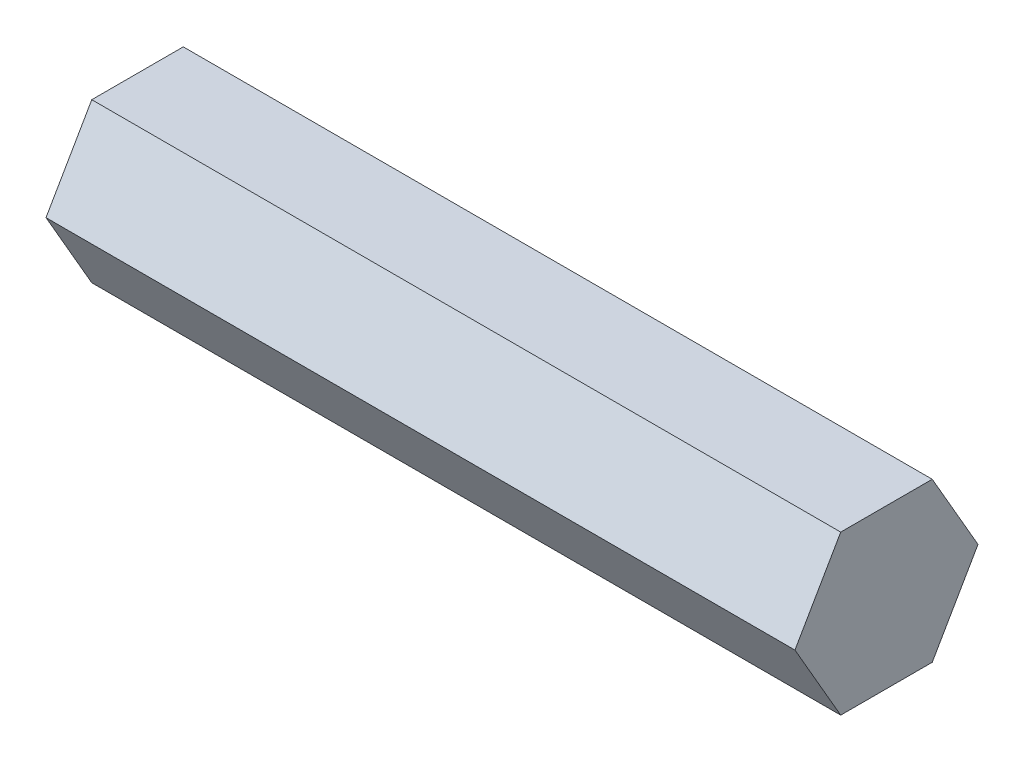
ISO-10303-21;
HEADER;
FILE_DESCRIPTION(('STEP AP214'),'2;1');
FILE_NAME('part.step','',(''),(''),'','','');
FILE_SCHEMA(('AUTOMOTIVE_DESIGN { 1 0 10303 214 1 1 1 1 }'));
ENDSEC;
DATA;
#1=APPLICATION_CONTEXT('core data for automotive mechanical design processes');
#2=APPLICATION_PROTOCOL_DEFINITION('international standard','automotive_design',2000,#1);
#3=PRODUCT_CONTEXT('',#1,'mechanical');
#4=PRODUCT('Part','Part','',(#3));
#5=PRODUCT_RELATED_PRODUCT_CATEGORY('part','',(#4));
#6=PRODUCT_DEFINITION_FORMATION('','',#4);
#7=PRODUCT_DEFINITION_CONTEXT('part definition',#1,'design');
#8=PRODUCT_DEFINITION('design','',#6,#7);
#9=PRODUCT_DEFINITION_SHAPE('','',#8);
#10=(LENGTH_UNIT() NAMED_UNIT(*) SI_UNIT(.MILLI.,.METRE.));
#11=(NAMED_UNIT(*) PLANE_ANGLE_UNIT() SI_UNIT($,.RADIAN.));
#12=(NAMED_UNIT(*) SI_UNIT($,.STERADIAN.) SOLID_ANGLE_UNIT());
#13=UNCERTAINTY_MEASURE_WITH_UNIT(LENGTH_MEASURE(1.E-05),#10,'distance_accuracy_value','');
#14=(GEOMETRIC_REPRESENTATION_CONTEXT(3) GLOBAL_UNCERTAINTY_ASSIGNED_CONTEXT((#13)) GLOBAL_UNIT_ASSIGNED_CONTEXT((#10,
#11,#12)) REPRESENTATION_CONTEXT('',''));
#15=CARTESIAN_POINT('',(0.,0.,0.));
#16=DIRECTION('',(0.,0.,1.));
#17=DIRECTION('',(1.,0.,0.));
#18=AXIS2_PLACEMENT_3D('',#15,#16,#17);
#19=CARTESIAN_POINT('',(60.,-6.34999999999995,-3.66617420935419));
#20=DIRECTION('',(0.,0.499999999999995,0.866025403784441));
#21=DIRECTION('',(0.,-0.866025403784442,0.499999999999995));
#22=AXIS2_PLACEMENT_3D('',#19,#20,#21);
#23=PLANE('',#22);
#24=DIRECTION('',(0.,0.866025403784442,-0.499999999999995));
#25=VECTOR('',#24,1.);
#26=CARTESIAN_POINT('',(0.,-6.34999999999995,-3.66617420935419));
#27=LINE('',#26,#25);
#28=CARTESIAN_POINT('',(0.,-6.34999999999995,-3.66617420935419));
#29=VERTEX_POINT('',#28);
#30=CARTESIAN_POINT('',(0.,0.,-7.33234841870824));
#31=VERTEX_POINT('',#30);
#32=EDGE_CURVE('E128',#29,#31,#27,.T.);
#33=ORIENTED_EDGE('',*,*,#32,.T.);
#34=DIRECTION('',(-1.,0.,0.));
#35=VECTOR('',#34,1.);
#36=CARTESIAN_POINT('',(60.,0.,-7.33234841870824));
#37=LINE('',#36,#35);
#38=CARTESIAN_POINT('',(60.,0.,-7.33234841870824));
#39=VERTEX_POINT('',#38);
#40=EDGE_CURVE('E11',#39,#31,#37,.T.);
#41=ORIENTED_EDGE('',*,*,#40,.F.);
#42=DIRECTION('',(0.,0.866025403784442,-0.499999999999995));
#43=VECTOR('',#42,1.);
#44=CARTESIAN_POINT('',(60.,-6.34999999999995,-3.66617420935419));
#45=LINE('',#44,#43);
#46=CARTESIAN_POINT('',(60.,-6.34999999999995,-3.66617420935419));
#47=VERTEX_POINT('',#46);
#48=EDGE_CURVE('E144',#47,#39,#45,.T.);
#49=ORIENTED_EDGE('',*,*,#48,.F.);
#50=DIRECTION('',(-1.,0.,0.));
#51=VECTOR('',#50,1.);
#52=CARTESIAN_POINT('',(60.,-6.34999999999995,-3.66617420935419));
#53=LINE('',#52,#51);
#54=EDGE_CURVE('E124',#47,#29,#53,.T.);
#55=ORIENTED_EDGE('',*,*,#54,.T.);
#56=EDGE_LOOP('',(#33,#41,#49,#55));
#57=FACE_BOUND('',#56,.T.);
#58=ADVANCED_FACE('F39',(#57),#23,.F.);
#59=CARTESIAN_POINT('',(60.,0.,-7.33234841870824));
#60=DIRECTION('',(0.,-0.500000000000001,0.866025403784438));
#61=DIRECTION('',(0.,-0.866025403784438,-0.500000000000001));
#62=AXIS2_PLACEMENT_3D('',#59,#60,#61);
#63=PLANE('',#62);
#64=DIRECTION('',(0.,0.866025403784438,0.500000000000001));
#65=VECTOR('',#64,1.);
#66=CARTESIAN_POINT('',(0.,0.,-7.33234841870824));
#67=LINE('',#66,#65);
#68=CARTESIAN_POINT('',(0.,6.35,-3.6661742093541));
#69=VERTEX_POINT('',#68);
#70=EDGE_CURVE('E132',#31,#69,#67,.T.);
#71=ORIENTED_EDGE('',*,*,#70,.T.);
#72=DIRECTION('',(-1.,0.,0.));
#73=VECTOR('',#72,1.);
#74=CARTESIAN_POINT('',(60.,6.35,-3.6661742093541));
#75=LINE('',#74,#73);
#76=CARTESIAN_POINT('',(60.,6.35,-3.6661742093541));
#77=VERTEX_POINT('',#76);
#78=EDGE_CURVE('E48',#77,#69,#75,.T.);
#79=ORIENTED_EDGE('',*,*,#78,.F.);
#80=DIRECTION('',(0.,0.866025403784438,0.500000000000001));
#81=VECTOR('',#80,1.);
#82=CARTESIAN_POINT('',(60.,0.,-7.33234841870824));
#83=LINE('',#82,#81);
#84=EDGE_CURVE('E93',#39,#77,#83,.T.);
#85=ORIENTED_EDGE('',*,*,#84,.F.);
#86=ORIENTED_EDGE('',*,*,#40,.T.);
#87=EDGE_LOOP('',(#71,#79,#85,#86));
#88=FACE_BOUND('',#87,.T.);
#89=ADVANCED_FACE('F172',(#88),#63,.F.);
#90=CARTESIAN_POINT('',(60.,6.35,-3.6661742093541));
#91=DIRECTION('',(0.,-1.,0.));
#92=DIRECTION('',(0.,0.,-1.));
#93=AXIS2_PLACEMENT_3D('',#90,#91,#92);
#94=PLANE('',#93);
#95=DIRECTION('',(0.,0.,1.));
#96=VECTOR('',#95,1.);
#97=CARTESIAN_POINT('',(0.,6.35,-3.6661742093541));
#98=LINE('',#97,#96);
#99=CARTESIAN_POINT('',(0.,6.34999999999997,3.66617420935415));
#100=VERTEX_POINT('',#99);
#101=EDGE_CURVE('E135',#69,#100,#98,.T.);
#102=ORIENTED_EDGE('',*,*,#101,.T.);
#103=DIRECTION('',(-1.,0.,0.));
#104=VECTOR('',#103,1.);
#105=CARTESIAN_POINT('',(60.,6.34999999999997,3.66617420935415));
#106=LINE('',#105,#104);
#107=CARTESIAN_POINT('',(60.,6.34999999999997,3.66617420935415));
#108=VERTEX_POINT('',#107);
#109=EDGE_CURVE('E117',#108,#100,#106,.T.);
#110=ORIENTED_EDGE('',*,*,#109,.F.);
#111=DIRECTION('',(0.,0.,1.));
#112=VECTOR('',#111,1.);
#113=CARTESIAN_POINT('',(60.,6.35,-3.6661742093541));
#114=LINE('',#113,#112);
#115=EDGE_CURVE('E106',#77,#108,#114,.T.);
#116=ORIENTED_EDGE('',*,*,#115,.F.);
#117=ORIENTED_EDGE('',*,*,#78,.T.);
#118=EDGE_LOOP('',(#102,#110,#116,#117));
#119=FACE_BOUND('',#118,.T.);
#120=ADVANCED_FACE('F154',(#119),#94,.F.);
#121=CARTESIAN_POINT('',(60.,6.34999999999997,3.66617420935415));
#122=DIRECTION('',(0.,-0.499999999999995,-0.866025403784442));
#123=DIRECTION('',(0.,0.866025403784442,-0.499999999999995));
#124=AXIS2_PLACEMENT_3D('',#121,#122,#123);
#125=PLANE('',#124);
#126=DIRECTION('',(0.,-0.866025403784442,0.499999999999995));
#127=VECTOR('',#126,1.);
#128=CARTESIAN_POINT('',(0.,6.34999999999997,3.66617420935415));
#129=LINE('',#128,#127);
#130=CARTESIAN_POINT('',(0.,0.,7.33234841870824));
#131=VERTEX_POINT('',#130);
#132=EDGE_CURVE('E115',#100,#131,#129,.T.);
#133=ORIENTED_EDGE('',*,*,#132,.T.);
#134=DIRECTION('',(-1.,0.,0.));
#135=VECTOR('',#134,1.);
#136=CARTESIAN_POINT('',(60.,0.,7.33234841870824));
#137=LINE('',#136,#135);
#138=CARTESIAN_POINT('',(60.,0.,7.33234841870824));
#139=VERTEX_POINT('',#138);
#140=EDGE_CURVE('E112',#139,#131,#137,.T.);
#141=ORIENTED_EDGE('',*,*,#140,.F.);
#142=DIRECTION('',(0.,-0.866025403784442,0.499999999999995));
#143=VECTOR('',#142,1.);
#144=CARTESIAN_POINT('',(60.,6.34999999999997,3.66617420935415));
#145=LINE('',#144,#143);
#146=EDGE_CURVE('E100',#108,#139,#145,.T.);
#147=ORIENTED_EDGE('',*,*,#146,.F.);
#148=ORIENTED_EDGE('',*,*,#109,.T.);
#149=EDGE_LOOP('',(#133,#141,#147,#148));
#150=FACE_BOUND('',#149,.T.);
#151=ADVANCED_FACE('F113',(#150),#125,.F.);
#152=CARTESIAN_POINT('',(60.,0.,7.33234841870824));
#153=DIRECTION('',(0.,0.500000000000007,-0.866025403784435));
#154=DIRECTION('',(0.,0.866025403784435,0.500000000000007));
#155=AXIS2_PLACEMENT_3D('',#152,#153,#154);
#156=PLANE('',#155);
#157=DIRECTION('',(0.,-0.866025403784435,-0.500000000000007));
#158=VECTOR('',#157,1.);
#159=CARTESIAN_POINT('',(0.,0.,7.33234841870824));
#160=LINE('',#159,#158);
#161=CARTESIAN_POINT('',(0.,-6.35000000000003,3.66617420935406));
#162=VERTEX_POINT('',#161);
#163=EDGE_CURVE('E79',#131,#162,#160,.T.);
#164=ORIENTED_EDGE('',*,*,#163,.T.);
#165=DIRECTION('',(-1.,0.,0.));
#166=VECTOR('',#165,1.);
#167=CARTESIAN_POINT('',(60.,-6.35000000000003,3.66617420935406));
#168=LINE('',#167,#166);
#169=CARTESIAN_POINT('',(60.,-6.35000000000003,3.66617420935406));
#170=VERTEX_POINT('',#169);
#171=EDGE_CURVE('E118',#170,#162,#168,.T.);
#172=ORIENTED_EDGE('',*,*,#171,.F.);
#173=DIRECTION('',(0.,-0.866025403784435,-0.500000000000007));
#174=VECTOR('',#173,1.);
#175=CARTESIAN_POINT('',(60.,0.,7.33234841870824));
#176=LINE('',#175,#174);
#177=EDGE_CURVE('E104',#139,#170,#176,.T.);
#178=ORIENTED_EDGE('',*,*,#177,.F.);
#179=ORIENTED_EDGE('',*,*,#140,.T.);
#180=EDGE_LOOP('',(#164,#172,#178,#179));
#181=FACE_BOUND('',#180,.T.);
#182=ADVANCED_FACE('F120',(#181),#156,.F.);
#183=CARTESIAN_POINT('',(60.,-6.35000000000003,3.66617420935406));
#184=DIRECTION('',(0.,1.,0.));
#185=DIRECTION('',(0.,0.,1.));
#186=AXIS2_PLACEMENT_3D('',#183,#184,#185);
#187=PLANE('',#186);
#188=DIRECTION('',(0.,0.,-1.));
#189=VECTOR('',#188,1.);
#190=CARTESIAN_POINT('',(0.,-6.35000000000003,3.66617420935406));
#191=LINE('',#190,#189);
#192=EDGE_CURVE('E85',#162,#29,#191,.T.);
#193=ORIENTED_EDGE('',*,*,#192,.T.);
#194=ORIENTED_EDGE('',*,*,#54,.F.);
#195=DIRECTION('',(0.,0.,-1.));
#196=VECTOR('',#195,1.);
#197=CARTESIAN_POINT('',(60.,-6.35000000000003,3.66617420935406));
#198=LINE('',#197,#196);
#199=EDGE_CURVE('E56',#170,#47,#198,.T.);
#200=ORIENTED_EDGE('',*,*,#199,.F.);
#201=ORIENTED_EDGE('',*,*,#171,.T.);
#202=EDGE_LOOP('',(#193,#194,#200,#201));
#203=FACE_BOUND('',#202,.T.);
#204=ADVANCED_FACE('F161',(#203),#187,.F.);
#205=CARTESIAN_POINT('',(60.,0.,0.));
#206=DIRECTION('',(1.,0.,0.));
#207=DIRECTION('',(0.,0.,-1.));
#208=AXIS2_PLACEMENT_3D('',#205,#206,#207);
#209=PLANE('',#208);
#210=ORIENTED_EDGE('',*,*,#48,.T.);
#211=ORIENTED_EDGE('',*,*,#84,.T.);
#212=ORIENTED_EDGE('',*,*,#115,.T.);
#213=ORIENTED_EDGE('',*,*,#146,.T.);
#214=ORIENTED_EDGE('',*,*,#177,.T.);
#215=ORIENTED_EDGE('',*,*,#199,.T.);
#216=EDGE_LOOP('',(#210,#211,#212,#213,#214,#215));
#217=FACE_BOUND('',#216,.T.);
#218=ADVANCED_FACE('F102',(#217),#209,.T.);
#219=CARTESIAN_POINT('',(0.,0.,0.));
#220=DIRECTION('',(1.,0.,0.));
#221=DIRECTION('',(0.,0.,-1.));
#222=AXIS2_PLACEMENT_3D('',#219,#220,#221);
#223=PLANE('',#222);
#224=ORIENTED_EDGE('',*,*,#32,.F.);
#225=ORIENTED_EDGE('',*,*,#192,.F.);
#226=ORIENTED_EDGE('',*,*,#163,.F.);
#227=ORIENTED_EDGE('',*,*,#132,.F.);
#228=ORIENTED_EDGE('',*,*,#101,.F.);
#229=ORIENTED_EDGE('',*,*,#70,.F.);
#230=EDGE_LOOP('',(#224,#225,#226,#227,#228,#229));
#231=FACE_BOUND('',#230,.T.);
#232=ADVANCED_FACE('F157',(#231),#223,.F.);
#233=CLOSED_SHELL('',(#58,#89,#120,#151,#182,#204,#218,#232));
#234=MANIFOLD_SOLID_BREP('B2',#233);
#235=ADVANCED_BREP_SHAPE_REPRESENTATION('',(#18,#234),#14);
#236=SHAPE_DEFINITION_REPRESENTATION(#9,#235);
ENDSEC;
END-ISO-10303-21;
